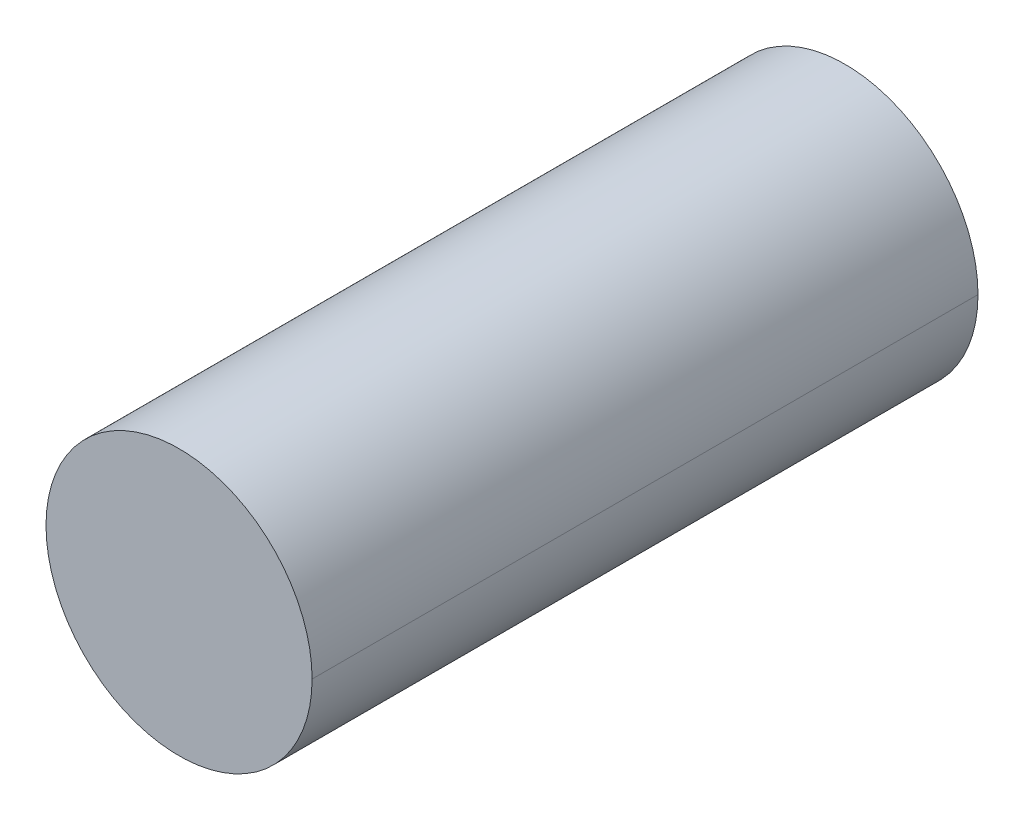
ISO-10303-21;
HEADER;
FILE_DESCRIPTION(('STEP AP214'),'2;1');
FILE_NAME('part.step','',(''),(''),'','','');
FILE_SCHEMA(('AUTOMOTIVE_DESIGN { 1 0 10303 214 1 1 1 1 }'));
ENDSEC;
DATA;
#1=APPLICATION_CONTEXT('core data for automotive mechanical design processes');
#2=APPLICATION_PROTOCOL_DEFINITION('international standard','automotive_design',2000,#1);
#3=PRODUCT_CONTEXT('',#1,'mechanical');
#4=PRODUCT('Part','Part','',(#3));
#5=PRODUCT_RELATED_PRODUCT_CATEGORY('part','',(#4));
#6=PRODUCT_DEFINITION_FORMATION('','',#4);
#7=PRODUCT_DEFINITION_CONTEXT('part definition',#1,'design');
#8=PRODUCT_DEFINITION('design','',#6,#7);
#9=PRODUCT_DEFINITION_SHAPE('','',#8);
#10=(LENGTH_UNIT() NAMED_UNIT(*) SI_UNIT(.MILLI.,.METRE.));
#11=(NAMED_UNIT(*) PLANE_ANGLE_UNIT() SI_UNIT($,.RADIAN.));
#12=(NAMED_UNIT(*) SI_UNIT($,.STERADIAN.) SOLID_ANGLE_UNIT());
#13=UNCERTAINTY_MEASURE_WITH_UNIT(LENGTH_MEASURE(1.E-05),#10,'distance_accuracy_value','');
#14=(GEOMETRIC_REPRESENTATION_CONTEXT(3) GLOBAL_UNCERTAINTY_ASSIGNED_CONTEXT((#13)) GLOBAL_UNIT_ASSIGNED_CONTEXT((#10,
#11,#12)) REPRESENTATION_CONTEXT('',''));
#15=CARTESIAN_POINT('',(0.,0.,0.));
#16=DIRECTION('',(0.,0.,1.));
#17=DIRECTION('',(1.,0.,0.));
#18=AXIS2_PLACEMENT_3D('',#15,#16,#17);
#19=CARTESIAN_POINT('',(0.,0.,0.));
#20=DIRECTION('',(0.,0.,-1.));
#21=DIRECTION('',(1.,0.,0.));
#22=AXIS2_PLACEMENT_3D('',#19,#20,#21);
#23=CYLINDRICAL_SURFACE('',#22,0.1999996);
#24=DIRECTION('',(0.,0.,-1.));
#25=VECTOR('',#24,1.);
#26=CARTESIAN_POINT('',(-0.1999996,0.,0.));
#27=LINE('',#26,#25);
#28=CARTESIAN_POINT('',(-0.1999996,0.,1.00099876));
#29=VERTEX_POINT('',#28);
#30=CARTESIAN_POINT('',(-0.1999996,0.,0.));
#31=VERTEX_POINT('',#30);
#32=EDGE_CURVE('E54',#29,#31,#27,.T.);
#33=ORIENTED_EDGE('',*,*,#32,.F.);
#34=CARTESIAN_POINT('',(0.,0.,1.00099876));
#35=DIRECTION('',(0.,0.,1.));
#36=DIRECTION('',(1.,0.,0.));
#37=AXIS2_PLACEMENT_3D('',#34,#35,#36);
#38=CIRCLE('',#37,0.1999996);
#39=CARTESIAN_POINT('',(0.1999996,0.,1.00099876));
#40=VERTEX_POINT('',#39);
#41=EDGE_CURVE('E27',#40,#29,#38,.T.);
#42=ORIENTED_EDGE('',*,*,#41,.F.);
#43=DIRECTION('',(0.,0.,-1.));
#44=VECTOR('',#43,1.);
#45=CARTESIAN_POINT('',(0.1999996,0.,0.));
#46=LINE('',#45,#44);
#47=CARTESIAN_POINT('',(0.1999996,0.,0.));
#48=VERTEX_POINT('',#47);
#49=EDGE_CURVE('E20',#40,#48,#46,.T.);
#50=ORIENTED_EDGE('',*,*,#49,.T.);
#51=CARTESIAN_POINT('',(0.,0.,0.));
#52=DIRECTION('',(0.,0.,1.));
#53=DIRECTION('',(1.,0.,0.));
#54=AXIS2_PLACEMENT_3D('',#51,#52,#53);
#55=CIRCLE('',#54,0.1999996);
#56=EDGE_CURVE('E11',#48,#31,#55,.T.);
#57=ORIENTED_EDGE('',*,*,#56,.T.);
#58=EDGE_LOOP('',(#33,#42,#50,#57));
#59=FACE_BOUND('',#58,.T.);
#60=ADVANCED_FACE('F16',(#59),#23,.T.);
#61=CARTESIAN_POINT('',(0.1999996,0.,0.));
#62=DIRECTION('',(0.,0.,-1.));
#63=DIRECTION('',(0.,-1.,0.));
#64=AXIS2_PLACEMENT_3D('',#61,#62,#63);
#65=PLANE('',#64);
#66=ORIENTED_EDGE('',*,*,#56,.F.);
#67=CARTESIAN_POINT('',(0.,0.,0.));
#68=DIRECTION('',(0.,0.,1.));
#69=DIRECTION('',(1.,0.,0.));
#70=AXIS2_PLACEMENT_3D('',#67,#68,#69);
#71=CIRCLE('',#70,0.1999996);
#72=EDGE_CURVE('E61',#31,#48,#71,.T.);
#73=ORIENTED_EDGE('',*,*,#72,.F.);
#74=EDGE_LOOP('',(#66,#73));
#75=FACE_BOUND('',#74,.T.);
#76=ADVANCED_FACE('F106',(#75),#65,.T.);
#77=CARTESIAN_POINT('',(0.1999996,0.,1.00099876));
#78=DIRECTION('',(0.,0.,-1.));
#79=DIRECTION('',(0.,-1.,0.));
#80=AXIS2_PLACEMENT_3D('',#77,#78,#79);
#81=PLANE('',#80);
#82=ORIENTED_EDGE('',*,*,#41,.T.);
#83=CARTESIAN_POINT('',(0.,0.,1.00099876));
#84=DIRECTION('',(0.,0.,1.));
#85=DIRECTION('',(1.,0.,0.));
#86=AXIS2_PLACEMENT_3D('',#83,#84,#85);
#87=CIRCLE('',#86,0.1999996);
#88=EDGE_CURVE('E60',#29,#40,#87,.T.);
#89=ORIENTED_EDGE('',*,*,#88,.T.);
#90=EDGE_LOOP('',(#82,#89));
#91=FACE_BOUND('',#90,.T.);
#92=ADVANCED_FACE('F63',(#91),#81,.F.);
#93=CARTESIAN_POINT('',(0.,0.,0.));
#94=DIRECTION('',(0.,0.,-1.));
#95=DIRECTION('',(1.,0.,0.));
#96=AXIS2_PLACEMENT_3D('',#93,#94,#95);
#97=CYLINDRICAL_SURFACE('',#96,0.1999996);
#98=ORIENTED_EDGE('',*,*,#88,.F.);
#99=ORIENTED_EDGE('',*,*,#32,.T.);
#100=ORIENTED_EDGE('',*,*,#72,.T.);
#101=ORIENTED_EDGE('',*,*,#49,.F.);
#102=EDGE_LOOP('',(#98,#99,#100,#101));
#103=FACE_BOUND('',#102,.T.);
#104=ADVANCED_FACE('F18',(#103),#97,.T.);
#105=CLOSED_SHELL('',(#60,#76,#92,#104));
#106=MANIFOLD_SOLID_BREP('B1',#105);
#107=ADVANCED_BREP_SHAPE_REPRESENTATION('',(#18,#106),#14);
#108=SHAPE_DEFINITION_REPRESENTATION(#9,#107);
ENDSEC;
END-ISO-10303-21;
